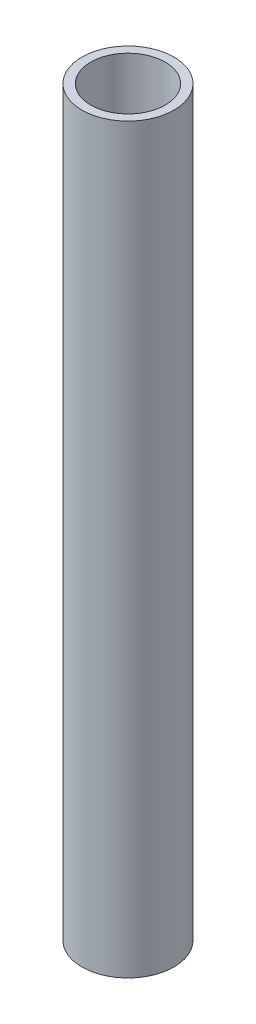
ISO-10303-21;
HEADER;
FILE_DESCRIPTION(('STEP AP214'),'2;1');
FILE_NAME('part.step','',(''),(''),'','','');
FILE_SCHEMA(('AUTOMOTIVE_DESIGN { 1 0 10303 214 1 1 1 1 }'));
ENDSEC;
DATA;
#1=APPLICATION_CONTEXT('core data for automotive mechanical design processes');
#2=APPLICATION_PROTOCOL_DEFINITION('international standard','automotive_design',2000,#1);
#3=PRODUCT_CONTEXT('',#1,'mechanical');
#4=PRODUCT('Part','Part','',(#3));
#5=PRODUCT_RELATED_PRODUCT_CATEGORY('part','',(#4));
#6=PRODUCT_DEFINITION_FORMATION('','',#4);
#7=PRODUCT_DEFINITION_CONTEXT('part definition',#1,'design');
#8=PRODUCT_DEFINITION('design','',#6,#7);
#9=PRODUCT_DEFINITION_SHAPE('','',#8);
#10=(LENGTH_UNIT() NAMED_UNIT(*) SI_UNIT(.MILLI.,.METRE.));
#11=(NAMED_UNIT(*) PLANE_ANGLE_UNIT() SI_UNIT($,.RADIAN.));
#12=(NAMED_UNIT(*) SI_UNIT($,.STERADIAN.) SOLID_ANGLE_UNIT());
#13=UNCERTAINTY_MEASURE_WITH_UNIT(LENGTH_MEASURE(1.E-05),#10,'distance_accuracy_value','');
#14=(GEOMETRIC_REPRESENTATION_CONTEXT(3) GLOBAL_UNCERTAINTY_ASSIGNED_CONTEXT((#13)) GLOBAL_UNIT_ASSIGNED_CONTEXT((#10,
#11,#12)) REPRESENTATION_CONTEXT('',''));
#15=CARTESIAN_POINT('',(0.,0.,0.));
#16=DIRECTION('',(0.,0.,1.));
#17=DIRECTION('',(1.,0.,0.));
#18=AXIS2_PLACEMENT_3D('',#15,#16,#17);
#19=CARTESIAN_POINT('',(0.,84.6582,0.));
#20=DIRECTION('',(0.,-1.,0.));
#21=DIRECTION('',(0.,0.,-1.));
#22=AXIS2_PLACEMENT_3D('',#19,#20,#21);
#23=CYLINDRICAL_SURFACE('',#22,5.25);
#24=CARTESIAN_POINT('',(0.,84.6582,0.));
#25=DIRECTION('',(0.,1.,0.));
#26=DIRECTION('',(0.,0.,1.));
#27=AXIS2_PLACEMENT_3D('',#24,#25,#26);
#28=CIRCLE('',#27,5.25);
#29=CARTESIAN_POINT('',(0.,84.6582,5.25));
#30=VERTEX_POINT('',#29);
#31=EDGE_CURVE('E10',#30,#30,#28,.T.);
#32=ORIENTED_EDGE('',*,*,#31,.F.);
#33=EDGE_LOOP('',(#32));
#34=FACE_BOUND('',#33,.T.);
#35=CARTESIAN_POINT('',(0.,0.,0.));
#36=DIRECTION('',(0.,1.,0.));
#37=DIRECTION('',(0.,0.,1.));
#38=AXIS2_PLACEMENT_3D('',#35,#36,#37);
#39=CIRCLE('',#38,5.25);
#40=CARTESIAN_POINT('',(0.,0.,5.25));
#41=VERTEX_POINT('',#40);
#42=EDGE_CURVE('E34',#41,#41,#39,.T.);
#43=ORIENTED_EDGE('',*,*,#42,.T.);
#44=EDGE_LOOP('',(#43));
#45=FACE_BOUND('',#44,.T.);
#46=ADVANCED_FACE('F31',(#34,#45),#23,.T.);
#47=CARTESIAN_POINT('',(0.,84.6582,0.));
#48=DIRECTION('',(0.,1.,0.));
#49=DIRECTION('',(0.,0.,1.));
#50=AXIS2_PLACEMENT_3D('',#47,#48,#49);
#51=PLANE('',#50);
#52=CARTESIAN_POINT('',(0.,84.6582,0.));
#53=DIRECTION('',(0.,1.,0.));
#54=DIRECTION('',(0.,0.,1.));
#55=AXIS2_PLACEMENT_3D('',#52,#53,#54);
#56=CIRCLE('',#55,4.25);
#57=CARTESIAN_POINT('',(0.,84.6582,4.25));
#58=VERTEX_POINT('',#57);
#59=EDGE_CURVE('E43',#58,#58,#56,.T.);
#60=ORIENTED_EDGE('',*,*,#59,.F.);
#61=EDGE_LOOP('',(#60));
#62=FACE_BOUND('',#61,.T.);
#63=ORIENTED_EDGE('',*,*,#31,.T.);
#64=EDGE_LOOP('',(#63));
#65=FACE_BOUND('',#64,.T.);
#66=ADVANCED_FACE('F58',(#62,#65),#51,.T.);
#67=CARTESIAN_POINT('',(0.,0.,0.));
#68=DIRECTION('',(0.,1.,0.));
#69=DIRECTION('',(0.,0.,1.));
#70=AXIS2_PLACEMENT_3D('',#67,#68,#69);
#71=PLANE('',#70);
#72=ORIENTED_EDGE('',*,*,#42,.F.);
#73=EDGE_LOOP('',(#72));
#74=FACE_BOUND('',#73,.T.);
#75=ADVANCED_FACE('F54',(#74),#71,.F.);
#76=CARTESIAN_POINT('',(0.,54.6582,0.));
#77=DIRECTION('',(0.,1.,0.));
#78=DIRECTION('',(0.,0.,1.));
#79=AXIS2_PLACEMENT_3D('',#76,#77,#78);
#80=CYLINDRICAL_SURFACE('',#79,4.25);
#81=CARTESIAN_POINT('',(0.,54.6582,0.));
#82=DIRECTION('',(0.,1.,0.));
#83=DIRECTION('',(0.,0.,1.));
#84=AXIS2_PLACEMENT_3D('',#81,#82,#83);
#85=CIRCLE('',#84,4.25);
#86=CARTESIAN_POINT('',(0.,54.6582,4.25));
#87=VERTEX_POINT('',#86);
#88=EDGE_CURVE('E41',#87,#87,#85,.T.);
#89=ORIENTED_EDGE('',*,*,#88,.F.);
#90=EDGE_LOOP('',(#89));
#91=FACE_BOUND('',#90,.T.);
#92=ORIENTED_EDGE('',*,*,#59,.T.);
#93=EDGE_LOOP('',(#92));
#94=FACE_BOUND('',#93,.T.);
#95=ADVANCED_FACE('F51',(#91,#94),#80,.F.);
#96=CARTESIAN_POINT('',(0.,54.6582,0.));
#97=DIRECTION('',(0.,1.,0.));
#98=DIRECTION('',(0.,0.,1.));
#99=AXIS2_PLACEMENT_3D('',#96,#97,#98);
#100=PLANE('',#99);
#101=ORIENTED_EDGE('',*,*,#88,.T.);
#102=EDGE_LOOP('',(#101));
#103=FACE_BOUND('',#102,.T.);
#104=ADVANCED_FACE('F49',(#103),#100,.T.);
#105=CLOSED_SHELL('',(#46,#66,#75,#95,#104));
#106=MANIFOLD_SOLID_BREP('B2',#105);
#107=ADVANCED_BREP_SHAPE_REPRESENTATION('',(#18,#106),#14);
#108=SHAPE_DEFINITION_REPRESENTATION(#9,#107);
ENDSEC;
END-ISO-10303-21;
